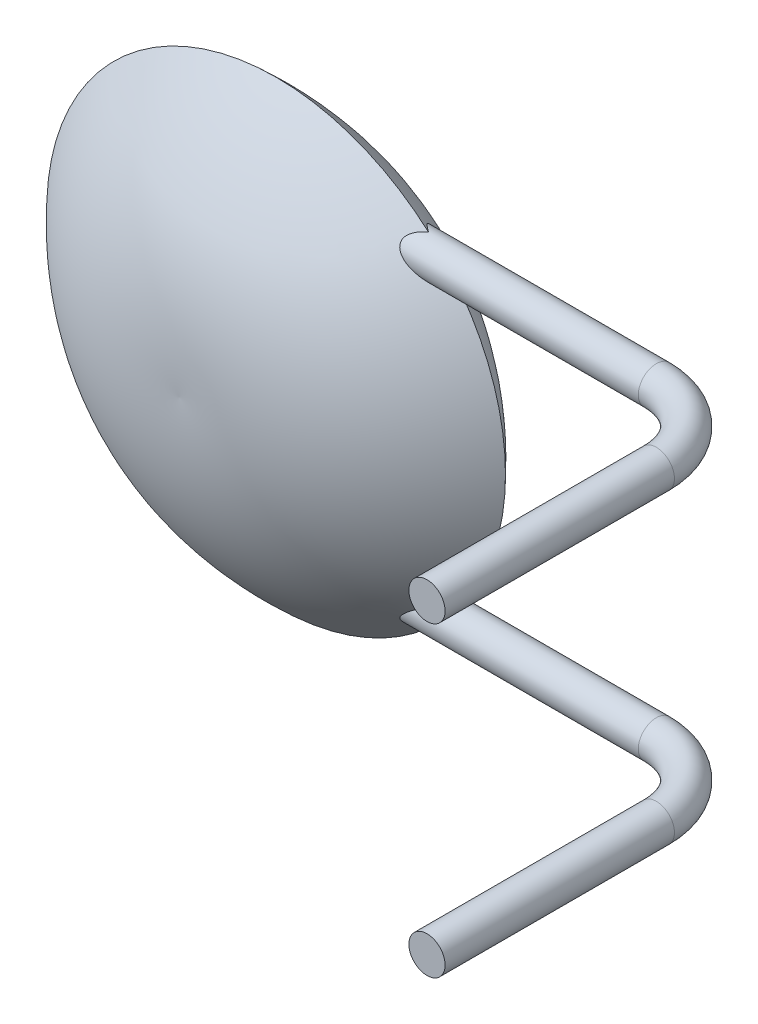
ISO-10303-21;
HEADER;
FILE_DESCRIPTION(('STEP AP214'),'2;1');
FILE_NAME('part.step','',(''),(''),'','','');
FILE_SCHEMA(('AUTOMOTIVE_DESIGN { 1 0 10303 214 1 1 1 1 }'));
ENDSEC;
DATA;
#1=APPLICATION_CONTEXT('core data for automotive mechanical design processes');
#2=APPLICATION_PROTOCOL_DEFINITION('international standard','automotive_design',2000,#1);
#3=PRODUCT_CONTEXT('',#1,'mechanical');
#4=PRODUCT('Part','Part','',(#3));
#5=PRODUCT_RELATED_PRODUCT_CATEGORY('part','',(#4));
#6=PRODUCT_DEFINITION_FORMATION('','',#4);
#7=PRODUCT_DEFINITION_CONTEXT('part definition',#1,'design');
#8=PRODUCT_DEFINITION('design','',#6,#7);
#9=PRODUCT_DEFINITION_SHAPE('','',#8);
#10=(LENGTH_UNIT() NAMED_UNIT(*) SI_UNIT(.MILLI.,.METRE.));
#11=(NAMED_UNIT(*) PLANE_ANGLE_UNIT() SI_UNIT($,.RADIAN.));
#12=(NAMED_UNIT(*) SI_UNIT($,.STERADIAN.) SOLID_ANGLE_UNIT());
#13=UNCERTAINTY_MEASURE_WITH_UNIT(LENGTH_MEASURE(1.E-05),#10,'distance_accuracy_value','');
#14=(GEOMETRIC_REPRESENTATION_CONTEXT(3) GLOBAL_UNCERTAINTY_ASSIGNED_CONTEXT((#13)) GLOBAL_UNIT_ASSIGNED_CONTEXT((#10,
#11,#12)) REPRESENTATION_CONTEXT('',''));
#15=CARTESIAN_POINT('',(0.,0.,0.));
#16=DIRECTION('',(0.,0.,1.));
#17=DIRECTION('',(1.,0.,0.));
#18=AXIS2_PLACEMENT_3D('',#15,#16,#17);
#19=CARTESIAN_POINT('',(0.,0.,0.8));
#20=CARTESIAN_POINT('',(1.1068824224434,0.,0.865042618922796));
#21=CARTESIAN_POINT('',(1.9,0.,0.));
#22=B_SPLINE_CURVE_WITH_KNOTS('',2,(#19,#20,#21),.UNSPECIFIED.,.F.,.F.,(3,3),(0.,1.),.UNSPECIFIED.);
#23=CARTESIAN_POINT('',(0.,0.,0.8));
#24=DIRECTION('',(0.,0.,1.));
#25=AXIS1_PLACEMENT('',#23,#24);
#26=SURFACE_OF_REVOLUTION('',#22,#25);
#27=CARTESIAN_POINT('',(1.53479640343597,-1.12,0.));
#28=CARTESIAN_POINT('',(1.52740638330839,-1.12000566612149,0.0065074062679365));
#29=CARTESIAN_POINT('',(1.51986000846679,-1.12042288590891,0.0128173819270295));
#30=CARTESIAN_POINT('',(1.50453898059812,-1.12197439928715,0.0250326227148049));
#31=CARTESIAN_POINT('',(1.49676478457888,-1.12310734002077,0.0309386281380667));
#32=CARTESIAN_POINT('',(1.47320974294176,-1.12741920008221,0.0480527645122609));
#33=CARTESIAN_POINT('',(1.45717168800999,-1.13151186926935,0.058678392963716));
#34=CARTESIAN_POINT('',(1.41816285082114,-1.14368367219915,0.0823864452400619));
#35=CARTESIAN_POINT('',(1.39502994735629,-1.15270764999625,0.0947058179390706));
#36=CARTESIAN_POINT('',(1.3486773992981,-1.17391225142004,0.116170770933312));
#37=CARTESIAN_POINT('',(1.32545767671567,-1.18609757651161,0.12531157636326));
#38=CARTESIAN_POINT('',(1.28975154946782,-1.20753786199314,0.136652120630259));
#39=CARTESIAN_POINT('',(1.27702643771841,-1.21573225964179,0.140137554299306));
#40=CARTESIAN_POINT('',(1.25202011252985,-1.23318975221472,0.14570295701662));
#41=CARTESIAN_POINT('',(1.23973800238448,-1.24245050830825,0.147785935799655));
#42=CARTESIAN_POINT('',(1.22025864456175,-1.2587127064149,0.149711275037536));
#43=CARTESIAN_POINT('',(1.21280934775998,-1.26534292718341,0.150087632642455));
#44=CARTESIAN_POINT('',(1.19851260339683,-1.27919535713052,0.149878038512571));
#45=CARTESIAN_POINT('',(1.19166425725663,-1.28641665013373,0.149293550242792));
#46=CARTESIAN_POINT('',(1.17751115625268,-1.30326215129572,0.146570149190876));
#47=CARTESIAN_POINT('',(1.17044664622052,-1.31306263986669,0.144112938682783));
#48=CARTESIAN_POINT('',(1.16083584259385,-1.3310479200157,0.137257775183314));
#49=CARTESIAN_POINT('',(1.1576123226858,-1.33905659929327,0.133466500397057));
#50=CARTESIAN_POINT('',(1.15501310548141,-1.35083009355637,0.126444002063828));
#51=CARTESIAN_POINT('',(1.15452325789862,-1.35473707755625,0.1238612285948));
#52=CARTESIAN_POINT('',(1.15436108753504,-1.36230149885185,0.118331550976894));
#53=CARTESIAN_POINT('',(1.15468853635081,-1.36595900557356,0.115384748779051));
#54=CARTESIAN_POINT('',(1.1566602394166,-1.37541623010942,0.107008834471892));
#55=CARTESIAN_POINT('',(1.15908943261749,-1.38083763628564,0.101334030033133));
#56=CARTESIAN_POINT('',(1.16733933341453,-1.39290469930388,0.086768964696163));
#57=CARTESIAN_POINT('',(1.17428530620215,-1.39861713500541,0.0778056009839755));
#58=CARTESIAN_POINT('',(1.1888437324668,-1.40704769943727,0.0615640442472039));
#59=CARTESIAN_POINT('',(1.1962458578947,-1.410062328654,0.0542199495699195));
#60=CARTESIAN_POINT('',(1.21180725891795,-1.41479816888227,0.0398783757020995));
#61=CARTESIAN_POINT('',(1.21996893199121,-1.41651511679705,0.0328821088898597));
#62=CARTESIAN_POINT('',(1.23388384421988,-1.41851407819609,0.0215536430297383));
#63=CARTESIAN_POINT('',(1.23951996427801,-1.41908483762997,0.0171194387800346));
#64=CARTESIAN_POINT('',(1.25088211627522,-1.4198247541265,0.00843561951156796));
#65=CARTESIAN_POINT('',(1.25660695380814,-1.4199973318003,0.00418474248092215));
#66=CARTESIAN_POINT('',(1.26237870704476,-1.42,0.));
#67=B_SPLINE_CURVE_WITH_KNOTS('',3,(#27,#28,#29,#30,#31,#32,#33,#34,#35,#36,#37,#38,#39,#40,#41,
#42,#43,#44,#45,#46,#47,#48,#49,#50,#51,#52,#53,#54,#55,#56,#57,#58,#59,#60,#61,#62,#63,#64,#65,
#66),.UNSPECIFIED.,.F.,.F.,(4,2,2,2,2,2,2,2,2,2,2,2,2,2,2,2,2,2,2,4),(0.,0.0295086285621638,
0.0589616460644433,0.117770672312027,0.20054194221167,0.283437019908039,0.329955837067183,
0.376374501693803,0.406248157490615,0.436076354844261,0.472573007761942,0.500317896389298,
0.514357612551909,0.528393405583865,0.552644703534187,0.590061819684776,0.622520061817714,
0.655084476614988,0.676655251835764,0.698040020424746),.UNSPECIFIED.);
#68=CARTESIAN_POINT('',(1.53479640343597,-1.12,0.));
#69=VERTEX_POINT('',#68);
#70=CARTESIAN_POINT('',(1.26237870704476,-1.42,0.));
#71=VERTEX_POINT('',#70);
#72=EDGE_CURVE('E59',#69,#71,#67,.T.);
#73=ORIENTED_EDGE('',*,*,#72,.F.);
#74=CARTESIAN_POINT('',(0.,0.,0.));
#75=DIRECTION('',(0.,0.,1.));
#76=DIRECTION('',(1.,0.,0.));
#77=AXIS2_PLACEMENT_3D('',#74,#75,#76);
#78=CIRCLE('',#77,1.9);
#79=CARTESIAN_POINT('',(1.53479640343597,1.12,0.));
#80=VERTEX_POINT('',#79);
#81=EDGE_CURVE('E65',#69,#80,#78,.T.);
#82=ORIENTED_EDGE('',*,*,#81,.T.);
#83=CARTESIAN_POINT('',(1.26237870704476,1.42,0.));
#84=CARTESIAN_POINT('',(1.25559554328648,1.41999456857551,0.00492014304322731));
#85=CARTESIAN_POINT('',(1.24886970762576,1.41975740287291,0.00993421966047264));
#86=CARTESIAN_POINT('',(1.23556192541091,1.41872449201915,0.0202082463031816));
#87=CARTESIAN_POINT('',(1.22898170696337,1.41792397512433,0.0254699358215006));
#88=CARTESIAN_POINT('',(1.21595925822409,1.41563907590765,0.0363422642912012));
#89=CARTESIAN_POINT('',(1.20952413111667,1.41413874011752,0.0419582475639488));
#90=CARTESIAN_POINT('',(1.19714961188435,1.41029768483243,0.0534142821507368));
#91=CARTESIAN_POINT('',(1.19120842996456,1.4079601784116,0.0592534015530102));
#92=CARTESIAN_POINT('',(1.18227056115896,1.4033363219247,0.0688290734417638));
#93=CARTESIAN_POINT('',(1.17903009981591,1.40138652442266,0.0724961556948264));
#94=CARTESIAN_POINT('',(1.17295662528676,1.39703793629623,0.0798744350920318));
#95=CARTESIAN_POINT('',(1.17012267087455,1.39464021346402,0.0835855080615008));
#96=CARTESIAN_POINT('',(1.16237976078778,1.38657257970906,0.0948433991124044));
#97=CARTESIAN_POINT('',(1.15828568791038,1.38005219855925,0.102458852283055));
#98=CARTESIAN_POINT('',(1.1545123164726,1.36661785740952,0.115012618858554));
#99=CARTESIAN_POINT('',(1.15402965039451,1.36014548046835,0.120162304690582));
#100=CARTESIAN_POINT('',(1.15555122268415,1.34667108909001,0.129181295184458));
#101=CARTESIAN_POINT('',(1.15755253988744,1.33966970585105,0.133052097040571));
#102=CARTESIAN_POINT('',(1.16461770774681,1.32279914266895,0.140834211399396));
#103=CARTESIAN_POINT('',(1.17064418950505,1.31303015485819,0.14400727531509));
#104=CARTESIAN_POINT('',(1.18333671740995,1.29599916162874,0.147946629858573));
#105=CARTESIAN_POINT('',(1.18974662585537,1.28858601196005,0.149016518619155));
#106=CARTESIAN_POINT('',(1.20330415041008,1.27435985803356,0.150104668376617));
#107=CARTESIAN_POINT('',(1.21045349290297,1.26754833035678,0.150120410056666));
#108=CARTESIAN_POINT('',(1.23175186665262,1.24863119501396,0.148991880910216));
#109=CARTESIAN_POINT('',(1.24645426704763,1.23722519405455,0.146799966108512));
#110=CARTESIAN_POINT('',(1.2765245037781,1.21596142914636,0.140364496724396));
#111=CARTESIAN_POINT('',(1.2918945265281,1.20610933250628,0.136113652302502));
#112=CARTESIAN_POINT('',(1.33047965548925,1.18336046981102,0.123438551638914));
#113=CARTESIAN_POINT('',(1.35386833322896,1.17131911635971,0.113990004751175));
#114=CARTESIAN_POINT('',(1.40047591522006,1.15048957621869,0.0919045290188739));
#115=CARTESIAN_POINT('',(1.42369512614219,1.14169052100626,0.079278495497347));
#116=CARTESIAN_POINT('',(1.4617746841807,1.13031411422238,0.0556532339404272));
#117=CARTESIAN_POINT('',(1.47683797986609,1.12664036536119,0.0455178960143255));
#118=CARTESIAN_POINT('',(1.49898048167156,1.12277634511889,0.02926287475906));
#119=CARTESIAN_POINT('',(1.50629635444251,1.12176249861861,0.0236601623323586));
#120=CARTESIAN_POINT('',(1.52072056360673,1.12037609316532,0.0120970829699083));
#121=CARTESIAN_POINT('',(1.52782854679989,1.12000456960071,0.00613615458173547));
#122=CARTESIAN_POINT('',(1.53479640343598,1.12,0.));
#123=B_SPLINE_CURVE_WITH_KNOTS('',3,(#83,#84,#85,#86,#87,#88,#89,#90,#91,#92,#93,#94,#95,#96,
#97,#98,#99,#100,#101,#102,#103,#104,#105,#106,#107,#108,#109,#110,#111,#112,#113,#114,#115,
#116,#117,#118,#119,#120,#121,#122),.UNSPECIFIED.,.F.,.F.,(4,2,2,2,2,2,2,2,2,2,2,2,2,2,2,2,2,2,
2,4),(0.,0.0251485981372747,0.0505128166516164,0.0764858469797419,0.102360242266352,
0.118129487907766,0.133861610751632,0.165567818083075,0.189924495773234,0.214252557129182,
0.249333182409598,0.278807338128121,0.308351931923458,0.364259945127059,0.420367369285465,
0.503812419271596,0.586975151788144,0.642377011123764,0.670159947822607,0.697987627439794),.UNSPECIFIED.);
#124=CARTESIAN_POINT('',(1.26237870704476,1.42,0.));
#125=VERTEX_POINT('',#124);
#126=EDGE_CURVE('E90',#125,#80,#123,.T.);
#127=ORIENTED_EDGE('',*,*,#126,.F.);
#128=EDGE_CURVE('E83',#125,#71,#78,.T.);
#129=ORIENTED_EDGE('',*,*,#128,.T.);
#130=EDGE_LOOP('',(#73,#82,#127,#129));
#131=FACE_BOUND('',#130,.T.);
#132=CARTESIAN_POINT('',(0.,0.,0.8));
#133=VERTEX_POINT('',#132);
#134=VERTEX_LOOP('',#133);
#135=FACE_BOUND('',#134,.T.);
#136=ADVANCED_FACE('F39',(#131,#135),#26,.F.);
#137=CARTESIAN_POINT('',(0.,0.,-0.8));
#138=CARTESIAN_POINT('',(1.1068824224434,0.,-0.865042618922796));
#139=CARTESIAN_POINT('',(1.9,0.,0.));
#140=B_SPLINE_CURVE_WITH_KNOTS('',2,(#137,#138,#139),.UNSPECIFIED.,.F.,.F.,(3,3),(0.,1.),.UNSPECIFIED.);
#141=CARTESIAN_POINT('',(0.,0.,0.8));
#142=DIRECTION('',(0.,0.,1.));
#143=AXIS1_PLACEMENT('',#141,#142);
#144=SURFACE_OF_REVOLUTION('',#140,#143);
#145=ORIENTED_EDGE('',*,*,#81,.F.);
#146=CARTESIAN_POINT('',(1.53479640343597,-1.12,0.));
#147=CARTESIAN_POINT('',(1.52740638330839,-1.12000566612149,-0.0065074062679365));
#148=CARTESIAN_POINT('',(1.51986000846679,-1.12042288590891,-0.0128173819270295));
#149=CARTESIAN_POINT('',(1.50453898059812,-1.12197439928715,-0.0250326227148049));
#150=CARTESIAN_POINT('',(1.49676478457888,-1.12310734002077,-0.0309386281380667));
#151=CARTESIAN_POINT('',(1.47320974294176,-1.12741920008221,-0.0480527645122609));
#152=CARTESIAN_POINT('',(1.45717168800999,-1.13151186926935,-0.058678392963716));
#153=CARTESIAN_POINT('',(1.41816285082114,-1.14368367219915,-0.0823864452400619));
#154=CARTESIAN_POINT('',(1.39502994735629,-1.15270764999625,-0.0947058179390706));
#155=CARTESIAN_POINT('',(1.3486773992981,-1.17391225142004,-0.116170770933312));
#156=CARTESIAN_POINT('',(1.32545767671567,-1.18609757651161,-0.12531157636326));
#157=CARTESIAN_POINT('',(1.28975154946782,-1.20753786199314,-0.136652120630259));
#158=CARTESIAN_POINT('',(1.27702643771841,-1.21573225964179,-0.140137554299306));
#159=CARTESIAN_POINT('',(1.25202011252985,-1.23318975221472,-0.14570295701662));
#160=CARTESIAN_POINT('',(1.23973800238448,-1.24245050830825,-0.147785935799655));
#161=CARTESIAN_POINT('',(1.22025864456175,-1.2587127064149,-0.149711275037536));
#162=CARTESIAN_POINT('',(1.21280934775998,-1.26534292718341,-0.150087632642455));
#163=CARTESIAN_POINT('',(1.19851260339683,-1.27919535713052,-0.149878038512571));
#164=CARTESIAN_POINT('',(1.19166425725663,-1.28641665013373,-0.149293550242792));
#165=CARTESIAN_POINT('',(1.17751115625268,-1.30326215129572,-0.146570149190876));
#166=CARTESIAN_POINT('',(1.17044664622052,-1.31306263986669,-0.144112938682783));
#167=CARTESIAN_POINT('',(1.16083584259385,-1.3310479200157,-0.137257775183314));
#168=CARTESIAN_POINT('',(1.1576123226858,-1.33905659929327,-0.133466500397057));
#169=CARTESIAN_POINT('',(1.15501310548141,-1.35083009355637,-0.126444002063828));
#170=CARTESIAN_POINT('',(1.15452325789862,-1.35473707755625,-0.1238612285948));
#171=CARTESIAN_POINT('',(1.15436108753504,-1.36230149885185,-0.118331550976894));
#172=CARTESIAN_POINT('',(1.15468853635081,-1.36595900557356,-0.115384748779051));
#173=CARTESIAN_POINT('',(1.1566602394166,-1.37541623010942,-0.107008834471892));
#174=CARTESIAN_POINT('',(1.15908943261749,-1.38083763628564,-0.101334030033133));
#175=CARTESIAN_POINT('',(1.16733933341453,-1.39290469930388,-0.086768964696163));
#176=CARTESIAN_POINT('',(1.17428530620215,-1.39861713500541,-0.0778056009839755));
#177=CARTESIAN_POINT('',(1.1888437324668,-1.40704769943727,-0.0615640442472039));
#178=CARTESIAN_POINT('',(1.1962458578947,-1.410062328654,-0.0542199495699195));
#179=CARTESIAN_POINT('',(1.21180725891795,-1.41479816888227,-0.0398783757020995));
#180=CARTESIAN_POINT('',(1.21996893199121,-1.41651511679705,-0.0328821088898597));
#181=CARTESIAN_POINT('',(1.23388384421988,-1.41851407819609,-0.0215536430297383));
#182=CARTESIAN_POINT('',(1.23951996427801,-1.41908483762997,-0.0171194387800346));
#183=CARTESIAN_POINT('',(1.25088211627522,-1.4198247541265,-0.00843561951156796));
#184=CARTESIAN_POINT('',(1.25660695380814,-1.4199973318003,-0.00418474248092215));
#185=CARTESIAN_POINT('',(1.26237870704476,-1.42,0.));
#186=B_SPLINE_CURVE_WITH_KNOTS('',3,(#146,#147,#148,#149,#150,#151,#152,#153,#154,#155,#156,
#157,#158,#159,#160,#161,#162,#163,#164,#165,#166,#167,#168,#169,#170,#171,#172,#173,#174,#175,
#176,#177,#178,#179,#180,#181,#182,#183,#184,#185),.UNSPECIFIED.,.F.,.F.,(4,2,2,2,2,2,2,2,2,2,2,
2,2,2,2,2,2,2,2,4),(0.,0.0295086285621638,0.0589616460644433,0.117770672312027,0.20054194221167,
0.283437019908039,0.329955837067183,0.376374501693803,0.406248157490615,0.436076354844261,
0.472573007761942,0.500317896389298,0.514357612551909,0.528393405583865,0.552644703534187,
0.590061819684776,0.622520061817714,0.655084476614988,0.676655251835764,0.698040020424746),.UNSPECIFIED.);
#187=EDGE_CURVE('E11',#69,#71,#186,.T.);
#188=ORIENTED_EDGE('',*,*,#187,.T.);
#189=ORIENTED_EDGE('',*,*,#128,.F.);
#190=CARTESIAN_POINT('',(1.26237870704476,1.42,0.));
#191=CARTESIAN_POINT('',(1.25559554328648,1.41999456857551,-0.00492014304322731));
#192=CARTESIAN_POINT('',(1.24886970762576,1.41975740287291,-0.00993421966047264));
#193=CARTESIAN_POINT('',(1.23556192541091,1.41872449201915,-0.0202082463031816));
#194=CARTESIAN_POINT('',(1.22898170696337,1.41792397512433,-0.0254699358215006));
#195=CARTESIAN_POINT('',(1.21595925822409,1.41563907590765,-0.0363422642912012));
#196=CARTESIAN_POINT('',(1.20952413111667,1.41413874011752,-0.0419582475639488));
#197=CARTESIAN_POINT('',(1.19714961188435,1.41029768483243,-0.0534142821507368));
#198=CARTESIAN_POINT('',(1.19120842996456,1.4079601784116,-0.0592534015530102));
#199=CARTESIAN_POINT('',(1.18227056115896,1.4033363219247,-0.0688290734417638));
#200=CARTESIAN_POINT('',(1.17903009981591,1.40138652442266,-0.0724961556948264));
#201=CARTESIAN_POINT('',(1.17295662528676,1.39703793629623,-0.0798744350920318));
#202=CARTESIAN_POINT('',(1.17012267087455,1.39464021346402,-0.0835855080615008));
#203=CARTESIAN_POINT('',(1.16237976078778,1.38657257970906,-0.0948433991124044));
#204=CARTESIAN_POINT('',(1.15828568791038,1.38005219855925,-0.102458852283055));
#205=CARTESIAN_POINT('',(1.1545123164726,1.36661785740952,-0.115012618858554));
#206=CARTESIAN_POINT('',(1.15402965039451,1.36014548046835,-0.120162304690582));
#207=CARTESIAN_POINT('',(1.15555122268415,1.34667108909001,-0.129181295184458));
#208=CARTESIAN_POINT('',(1.15755253988744,1.33966970585105,-0.133052097040571));
#209=CARTESIAN_POINT('',(1.16461770774681,1.32279914266895,-0.140834211399396));
#210=CARTESIAN_POINT('',(1.17064418950505,1.31303015485819,-0.14400727531509));
#211=CARTESIAN_POINT('',(1.18333671740995,1.29599916162874,-0.147946629858573));
#212=CARTESIAN_POINT('',(1.18974662585537,1.28858601196005,-0.149016518619155));
#213=CARTESIAN_POINT('',(1.20330415041008,1.27435985803356,-0.150104668376617));
#214=CARTESIAN_POINT('',(1.21045349290297,1.26754833035678,-0.150120410056666));
#215=CARTESIAN_POINT('',(1.23175186665262,1.24863119501396,-0.148991880910216));
#216=CARTESIAN_POINT('',(1.24645426704763,1.23722519405455,-0.146799966108512));
#217=CARTESIAN_POINT('',(1.2765245037781,1.21596142914636,-0.140364496724396));
#218=CARTESIAN_POINT('',(1.2918945265281,1.20610933250628,-0.136113652302502));
#219=CARTESIAN_POINT('',(1.33047965548925,1.18336046981102,-0.123438551638914));
#220=CARTESIAN_POINT('',(1.35386833322896,1.17131911635971,-0.113990004751175));
#221=CARTESIAN_POINT('',(1.40047591522006,1.15048957621869,-0.0919045290188739));
#222=CARTESIAN_POINT('',(1.42369512614219,1.14169052100626,-0.079278495497347));
#223=CARTESIAN_POINT('',(1.4617746841807,1.13031411422238,-0.0556532339404272));
#224=CARTESIAN_POINT('',(1.47683797986609,1.12664036536119,-0.0455178960143255));
#225=CARTESIAN_POINT('',(1.49898048167156,1.12277634511889,-0.02926287475906));
#226=CARTESIAN_POINT('',(1.50629635444251,1.12176249861861,-0.0236601623323586));
#227=CARTESIAN_POINT('',(1.52072056360673,1.12037609316532,-0.0120970829699083));
#228=CARTESIAN_POINT('',(1.52782854679989,1.12000456960071,-0.00613615458173547));
#229=CARTESIAN_POINT('',(1.53479640343598,1.12,0.));
#230=B_SPLINE_CURVE_WITH_KNOTS('',3,(#190,#191,#192,#193,#194,#195,#196,#197,#198,#199,#200,
#201,#202,#203,#204,#205,#206,#207,#208,#209,#210,#211,#212,#213,#214,#215,#216,#217,#218,#219,
#220,#221,#222,#223,#224,#225,#226,#227,#228,#229),.UNSPECIFIED.,.F.,.F.,(4,2,2,2,2,2,2,2,2,2,2,
2,2,2,2,2,2,2,2,4),(0.,0.0251485981372747,0.0505128166516164,0.0764858469797419,
0.102360242266352,0.118129487907766,0.133861610751632,0.165567818083075,0.189924495773234,
0.214252557129182,0.249333182409598,0.278807338128121,0.308351931923458,0.364259945127059,
0.420367369285465,0.503812419271596,0.586975151788144,0.642377011123764,0.670159947822607,
0.697987627439794),.UNSPECIFIED.);
#231=EDGE_CURVE('E53',#125,#80,#230,.T.);
#232=ORIENTED_EDGE('',*,*,#231,.T.);
#233=EDGE_LOOP('',(#145,#188,#189,#232));
#234=FACE_BOUND('',#233,.T.);
#235=CARTESIAN_POINT('',(0.,0.,-0.8));
#236=VERTEX_POINT('',#235);
#237=VERTEX_LOOP('',#236);
#238=FACE_BOUND('',#237,.T.);
#239=ADVANCED_FACE('F88',(#234,#238),#144,.T.);
#240=CARTESIAN_POINT('',(3.75,1.27,2.5));
#241=DIRECTION('',(0.,0.,1.));
#242=DIRECTION('',(1.,0.,0.));
#243=AXIS2_PLACEMENT_3D('',#240,#241,#242);
#244=PLANE('',#243);
#245=CARTESIAN_POINT('',(3.75,1.27,2.5));
#246=DIRECTION('',(0.,0.,1.));
#247=DIRECTION('',(1.,0.,0.));
#248=AXIS2_PLACEMENT_3D('',#245,#246,#247);
#249=CIRCLE('',#248,0.15);
#250=CARTESIAN_POINT('',(3.9,1.27,2.5));
#251=VERTEX_POINT('',#250);
#252=EDGE_CURVE('E92',#251,#251,#249,.T.);
#253=ORIENTED_EDGE('',*,*,#252,.T.);
#254=EDGE_LOOP('',(#253));
#255=FACE_BOUND('',#254,.T.);
#256=ADVANCED_FACE('F111',(#255),#244,.T.);
#257=CARTESIAN_POINT('',(0.,1.27,0.));
#258=DIRECTION('',(1.,0.,0.));
#259=DIRECTION('',(0.,0.,-1.));
#260=AXIS2_PLACEMENT_3D('',#257,#258,#259);
#261=CYLINDRICAL_SURFACE('',#260,0.15);
#262=ORIENTED_EDGE('',*,*,#231,.F.);
#263=ORIENTED_EDGE('',*,*,#126,.T.);
#264=EDGE_LOOP('',(#262,#263));
#265=FACE_BOUND('',#264,.T.);
#266=CARTESIAN_POINT('',(3.15,1.27,0.));
#267=DIRECTION('',(1.,0.,0.));
#268=DIRECTION('',(0.,0.,-1.));
#269=AXIS2_PLACEMENT_3D('',#266,#267,#268);
#270=CIRCLE('',#269,0.15);
#271=CARTESIAN_POINT('',(3.15,1.27,-0.15));
#272=VERTEX_POINT('',#271);
#273=EDGE_CURVE('E84',#272,#272,#270,.T.);
#274=ORIENTED_EDGE('',*,*,#273,.F.);
#275=EDGE_LOOP('',(#274));
#276=FACE_BOUND('',#275,.T.);
#277=ADVANCED_FACE('F105',(#265,#276),#261,.T.);
#278=CARTESIAN_POINT('',(3.15,1.27,0.6));
#279=DIRECTION('',(0.,-1.,0.));
#280=DIRECTION('',(0.,0.,-1.));
#281=AXIS2_PLACEMENT_3D('',#278,#279,#280);
#282=TOROIDAL_SURFACE('',#281,0.6,0.15);
#283=CARTESIAN_POINT('',(3.75,1.27,0.6));
#284=DIRECTION('',(0.,0.,1.));
#285=DIRECTION('',(1.,0.,0.));
#286=AXIS2_PLACEMENT_3D('',#283,#284,#285);
#287=CIRCLE('',#286,0.15);
#288=CARTESIAN_POINT('',(3.9,1.27,0.6));
#289=VERTEX_POINT('',#288);
#290=EDGE_CURVE('E130',#289,#289,#287,.T.);
#291=CARTESIAN_POINT('',(3.15,1.27,0.6));
#292=DIRECTION('',(0.,-1.,0.));
#293=DIRECTION('',(0.,0.,-1.));
#294=AXIS2_PLACEMENT_3D('',#291,#292,#293);
#295=CIRCLE('',#294,0.75);
#296=EDGE_CURVE('',#272,#289,#295,.T.);
#297=ORIENTED_EDGE('',*,*,#273,.T.);
#298=ORIENTED_EDGE('',*,*,#290,.F.);
#299=ORIENTED_EDGE('',*,*,#296,.T.);
#300=ORIENTED_EDGE('',*,*,#296,.F.);
#301=EDGE_LOOP('',(#297,#299,#298,#300));
#302=FACE_BOUND('',#301,.T.);
#303=ADVANCED_FACE('F110',(#302),#282,.T.);
#304=CARTESIAN_POINT('',(3.75,1.27,0.6));
#305=DIRECTION('',(0.,0.,1.));
#306=DIRECTION('',(1.,0.,0.));
#307=AXIS2_PLACEMENT_3D('',#304,#305,#306);
#308=CYLINDRICAL_SURFACE('',#307,0.15);
#309=ORIENTED_EDGE('',*,*,#252,.F.);
#310=EDGE_LOOP('',(#309));
#311=FACE_BOUND('',#310,.T.);
#312=ORIENTED_EDGE('',*,*,#290,.T.);
#313=EDGE_LOOP('',(#312));
#314=FACE_BOUND('',#313,.T.);
#315=ADVANCED_FACE('F160',(#311,#314),#308,.T.);
#316=CARTESIAN_POINT('',(3.75,-1.27,2.5));
#317=DIRECTION('',(0.,0.,1.));
#318=DIRECTION('',(1.,0.,0.));
#319=AXIS2_PLACEMENT_3D('',#316,#317,#318);
#320=PLANE('',#319);
#321=CARTESIAN_POINT('',(3.75,-1.27,2.5));
#322=DIRECTION('',(0.,0.,-1.));
#323=DIRECTION('',(1.,0.,0.));
#324=AXIS2_PLACEMENT_3D('',#321,#322,#323);
#325=CIRCLE('',#324,0.15);
#326=CARTESIAN_POINT('',(3.9,-1.27,2.5));
#327=VERTEX_POINT('',#326);
#328=EDGE_CURVE('E85',#327,#327,#325,.F.);
#329=ORIENTED_EDGE('',*,*,#328,.T.);
#330=EDGE_LOOP('',(#329));
#331=FACE_BOUND('',#330,.T.);
#332=ADVANCED_FACE('F113',(#331),#320,.T.);
#333=CARTESIAN_POINT('',(0.,-1.27,0.));
#334=DIRECTION('',(1.,0.,0.));
#335=DIRECTION('',(0.,0.,-1.));
#336=AXIS2_PLACEMENT_3D('',#333,#334,#335);
#337=CYLINDRICAL_SURFACE('',#336,0.15);
#338=ORIENTED_EDGE('',*,*,#187,.F.);
#339=ORIENTED_EDGE('',*,*,#72,.T.);
#340=EDGE_LOOP('',(#338,#339));
#341=FACE_BOUND('',#340,.T.);
#342=CARTESIAN_POINT('',(3.15,-1.27,0.));
#343=DIRECTION('',(-1.,0.,0.));
#344=DIRECTION('',(0.,0.,-1.));
#345=AXIS2_PLACEMENT_3D('',#342,#343,#344);
#346=CIRCLE('',#345,0.15);
#347=CARTESIAN_POINT('',(3.15,-1.27,-0.15));
#348=VERTEX_POINT('',#347);
#349=EDGE_CURVE('E236',#348,#348,#346,.F.);
#350=ORIENTED_EDGE('',*,*,#349,.F.);
#351=EDGE_LOOP('',(#350));
#352=FACE_BOUND('',#351,.T.);
#353=ADVANCED_FACE('F77',(#341,#352),#337,.T.);
#354=CARTESIAN_POINT('',(3.15,-1.27,0.6));
#355=DIRECTION('',(0.,-1.,0.));
#356=DIRECTION('',(0.,0.,-1.));
#357=AXIS2_PLACEMENT_3D('',#354,#355,#356);
#358=TOROIDAL_SURFACE('',#357,0.6,0.15);
#359=CARTESIAN_POINT('',(3.75,-1.27,0.6));
#360=DIRECTION('',(0.,0.,-1.));
#361=DIRECTION('',(1.,0.,0.));
#362=AXIS2_PLACEMENT_3D('',#359,#360,#361);
#363=CIRCLE('',#362,0.15);
#364=CARTESIAN_POINT('',(3.9,-1.27,0.6));
#365=VERTEX_POINT('',#364);
#366=EDGE_CURVE('E234',#365,#365,#363,.F.);
#367=CARTESIAN_POINT('',(3.15,-1.27,0.6));
#368=DIRECTION('',(0.,-1.,0.));
#369=DIRECTION('',(0.,0.,-1.));
#370=AXIS2_PLACEMENT_3D('',#367,#368,#369);
#371=CIRCLE('',#370,0.75);
#372=EDGE_CURVE('',#348,#365,#371,.T.);
#373=ORIENTED_EDGE('',*,*,#349,.T.);
#374=ORIENTED_EDGE('',*,*,#366,.F.);
#375=ORIENTED_EDGE('',*,*,#372,.T.);
#376=ORIENTED_EDGE('',*,*,#372,.F.);
#377=EDGE_LOOP('',(#373,#375,#374,#376));
#378=FACE_BOUND('',#377,.T.);
#379=ADVANCED_FACE('F143',(#378),#358,.T.);
#380=CARTESIAN_POINT('',(3.75,-1.27,0.6));
#381=DIRECTION('',(0.,0.,1.));
#382=DIRECTION('',(1.,0.,0.));
#383=AXIS2_PLACEMENT_3D('',#380,#381,#382);
#384=CYLINDRICAL_SURFACE('',#383,0.15);
#385=ORIENTED_EDGE('',*,*,#328,.F.);
#386=EDGE_LOOP('',(#385));
#387=FACE_BOUND('',#386,.T.);
#388=ORIENTED_EDGE('',*,*,#366,.T.);
#389=EDGE_LOOP('',(#388));
#390=FACE_BOUND('',#389,.T.);
#391=ADVANCED_FACE('F146',(#387,#390),#384,.T.);
#392=CLOSED_SHELL('',(#136,#239,#256,#277,#303,#315,#332,#353,#379,#391));
#393=MANIFOLD_SOLID_BREP('B2',#392);
#394=ADVANCED_BREP_SHAPE_REPRESENTATION('',(#18,#393),#14);
#395=SHAPE_DEFINITION_REPRESENTATION(#9,#394);
ENDSEC;
END-ISO-10303-21;
